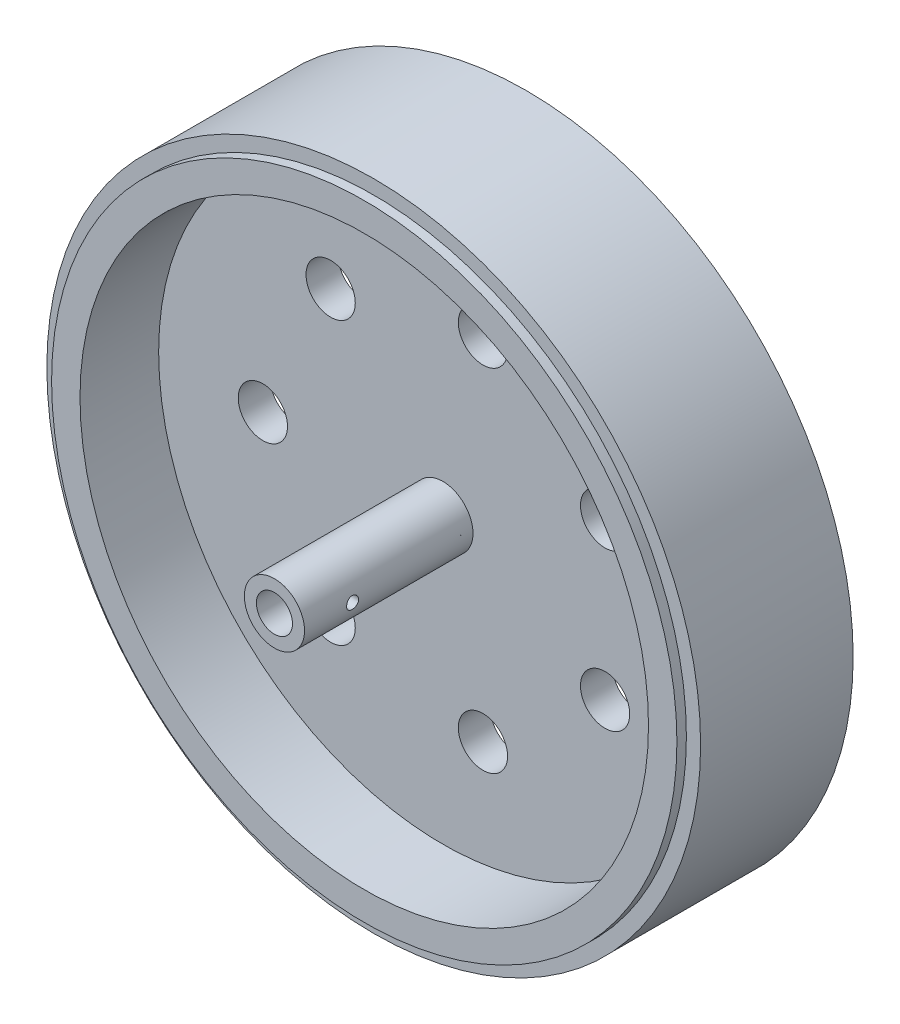
ISO-10303-21;
HEADER;
FILE_DESCRIPTION(('STEP AP214'),'2;1');
FILE_NAME('part.step','',(''),(''),'','','');
FILE_SCHEMA(('AUTOMOTIVE_DESIGN { 1 0 10303 214 1 1 1 1 }'));
ENDSEC;
DATA;
#1=APPLICATION_CONTEXT('core data for automotive mechanical design processes');
#2=APPLICATION_PROTOCOL_DEFINITION('international standard','automotive_design',2000,#1);
#3=PRODUCT_CONTEXT('',#1,'mechanical');
#4=PRODUCT('Part','Part','',(#3));
#5=PRODUCT_RELATED_PRODUCT_CATEGORY('part','',(#4));
#6=PRODUCT_DEFINITION_FORMATION('','',#4);
#7=PRODUCT_DEFINITION_CONTEXT('part definition',#1,'design');
#8=PRODUCT_DEFINITION('design','',#6,#7);
#9=PRODUCT_DEFINITION_SHAPE('','',#8);
#10=(LENGTH_UNIT() NAMED_UNIT(*) SI_UNIT(.MILLI.,.METRE.));
#11=(NAMED_UNIT(*) PLANE_ANGLE_UNIT() SI_UNIT($,.RADIAN.));
#12=(NAMED_UNIT(*) SI_UNIT($,.STERADIAN.) SOLID_ANGLE_UNIT());
#13=UNCERTAINTY_MEASURE_WITH_UNIT(LENGTH_MEASURE(1.E-05),#10,'distance_accuracy_value','');
#14=(GEOMETRIC_REPRESENTATION_CONTEXT(3) GLOBAL_UNCERTAINTY_ASSIGNED_CONTEXT((#13)) GLOBAL_UNIT_ASSIGNED_CONTEXT((#10,
#11,#12)) REPRESENTATION_CONTEXT('',''));
#15=CARTESIAN_POINT('',(0.,0.,0.));
#16=DIRECTION('',(0.,0.,1.));
#17=DIRECTION('',(1.,0.,0.));
#18=AXIS2_PLACEMENT_3D('',#15,#16,#17);
#19=CARTESIAN_POINT('',(0.,0.,21.18));
#20=DIRECTION('',(0.,0.,-1.));
#21=DIRECTION('',(-1.,0.,0.));
#22=AXIS2_PLACEMENT_3D('',#19,#20,#21);
#23=CYLINDRICAL_SURFACE('',#22,3.175);
#24=CARTESIAN_POINT('',(0.,0.,21.18));
#25=DIRECTION('',(0.,0.,1.));
#26=DIRECTION('',(1.,0.,0.));
#27=AXIS2_PLACEMENT_3D('',#24,#25,#26);
#28=CIRCLE('',#27,3.175);
#29=CARTESIAN_POINT('',(3.175,0.,21.18));
#30=VERTEX_POINT('',#29);
#31=EDGE_CURVE('E113',#30,#30,#28,.T.);
#32=ORIENTED_EDGE('',*,*,#31,.F.);
#33=EDGE_LOOP('',(#32));
#34=FACE_BOUND('',#33,.T.);
#35=CARTESIAN_POINT('',(0.,0.,3.4));
#36=DIRECTION('',(0.,0.,1.));
#37=DIRECTION('',(1.,0.,0.));
#38=AXIS2_PLACEMENT_3D('',#35,#36,#37);
#39=CIRCLE('',#38,3.175);
#40=CARTESIAN_POINT('',(3.175,0.,3.4));
#41=VERTEX_POINT('',#40);
#42=EDGE_CURVE('E112',#41,#41,#39,.T.);
#43=ORIENTED_EDGE('',*,*,#42,.T.);
#44=EDGE_LOOP('',(#43));
#45=FACE_BOUND('',#44,.T.);
#46=CARTESIAN_POINT('',(3.17499999999999,0.,16.735));
#47=CARTESIAN_POINT('',(3.17499934963852,0.035291335813322,16.7349987017435));
#48=CARTESIAN_POINT('',(3.17440554588176,0.0705990842279666,16.7320479847155));
#49=CARTESIAN_POINT('',(3.17209402170752,0.140216577382527,16.7203324524268));
#50=CARTESIAN_POINT('',(3.17037540841218,0.174525506638761,16.711563018171));
#51=CARTESIAN_POINT('',(3.16600617291712,0.241128743842204,16.6884917912508));
#52=CARTESIAN_POINT('',(3.16335644363716,0.273424947137541,16.6741952976036));
#53=CARTESIAN_POINT('',(3.15741302752425,0.335158072928783,16.6404915228303));
#54=CARTESIAN_POINT('',(3.15411937904674,0.36459516557314,16.6210845460894));
#55=CARTESIAN_POINT('',(3.14720074984531,0.420175358094938,16.5774320561249));
#56=CARTESIAN_POINT('',(3.14357223395261,0.446274158985663,16.5531306943266));
#57=CARTESIAN_POINT('',(3.13641854587394,0.494053340446097,16.5004993155913));
#58=CARTESIAN_POINT('',(3.13289338177769,0.515733375929218,16.4721689843022));
#59=CARTESIAN_POINT('',(3.12631100551011,0.554248163375738,16.4119652174375));
#60=CARTESIAN_POINT('',(3.12325834176741,0.571037046179825,16.3800618961893));
#61=CARTESIAN_POINT('',(3.11801680217095,0.598999098278496,16.3138160449324));
#62=CARTESIAN_POINT('',(3.11582784098846,0.610172822347646,16.2794737562751));
#63=CARTESIAN_POINT('',(3.1125973133515,0.626443565426864,16.2098014289185));
#64=CARTESIAN_POINT('',(3.11154108518064,0.631618306203822,16.1744902344697));
#65=CARTESIAN_POINT('',(3.11065148163498,0.635985601106084,16.1034862634336));
#66=CARTESIAN_POINT('',(3.11081798122079,0.635178766923071,16.0677935262367));
#67=CARTESIAN_POINT('',(3.11234169979097,0.627668653919654,15.9976082896067));
#68=CARTESIAN_POINT('',(3.11368092565315,0.621054473054879,15.9631058074267));
#69=CARTESIAN_POINT('',(3.11737086811601,0.602258056735636,15.895710291319));
#70=CARTESIAN_POINT('',(3.1197216330219,0.590075555368932,15.8628173343364));
#71=CARTESIAN_POINT('',(3.12518817747759,0.560403237633447,15.7993178088182));
#72=CARTESIAN_POINT('',(3.12830902031702,0.542878106032392,15.7687281964736));
#73=CARTESIAN_POINT('',(3.13496082920894,0.50304291985365,15.7108905102673));
#74=CARTESIAN_POINT('',(3.13849184237362,0.480732315366585,15.6836428209995));
#75=CARTESIAN_POINT('',(3.14564408488328,0.431482458445969,15.6327483294398));
#76=CARTESIAN_POINT('',(3.14926579448925,0.4044671623699,15.6091751194095));
#77=CARTESIAN_POINT('',(3.15613318933649,0.346827490279374,15.5668833075987));
#78=CARTESIAN_POINT('',(3.15937886975498,0.316203067985911,15.5481647680786));
#79=CARTESIAN_POINT('',(3.16513648252163,0.252132710668114,15.5161000316415));
#80=CARTESIAN_POINT('',(3.16764726418653,0.218682455436665,15.5027622475357));
#81=CARTESIAN_POINT('',(3.1716434470729,0.149954600044902,15.4819160989855));
#82=CARTESIAN_POINT('',(3.17312897250337,0.114677221796005,15.4744070283832));
#83=CARTESIAN_POINT('',(3.17488996635461,0.0439289225732406,15.4655356518406));
#84=CARTESIAN_POINT('',(3.17518525904318,0.00847110848674091,15.4640726335919));
#85=CARTESIAN_POINT('',(3.17458757975615,-0.0621823332123733,15.4670636604283));
#86=CARTESIAN_POINT('',(3.17369467457818,-0.0973779754518083,15.4715173728889));
#87=CARTESIAN_POINT('',(3.17083333325091,-0.166183094066053,15.4861317672004));
#88=CARTESIAN_POINT('',(3.16887464016671,-0.199803987195838,15.4962407734962));
#89=CARTESIAN_POINT('',(3.16410055558756,-0.264873503462288,15.5218223289864));
#90=CARTESIAN_POINT('',(3.16128509991034,-0.296321963639837,15.5372952800198));
#91=CARTESIAN_POINT('',(3.15506043823642,-0.356578645290747,15.5733833815636));
#92=CARTESIAN_POINT('',(3.15164438527528,-0.385349830487638,15.5940591659597));
#93=CARTESIAN_POINT('',(3.14461356616975,-0.439050442140694,15.6398848364166));
#94=CARTESIAN_POINT('',(3.14099877874926,-0.463979456171032,15.6650352021639));
#95=CARTESIAN_POINT('',(3.13391107758673,-0.5096767751416,15.7195545784509));
#96=CARTESIAN_POINT('',(3.13044116248148,-0.530375941054894,15.7489819975805));
#97=CARTESIAN_POINT('',(3.12409961790583,-0.566537741732515,15.8109552144615));
#98=CARTESIAN_POINT('',(3.12122796449972,-0.582000586011043,15.8435008873792));
#99=CARTESIAN_POINT('',(3.11643230271083,-0.607156419404544,15.910622836305));
#100=CARTESIAN_POINT('',(3.11450339043839,-0.616879322367316,15.9451875341686));
#101=CARTESIAN_POINT('',(3.11180122362936,-0.630369993783269,16.0155027429667));
#102=CARTESIAN_POINT('',(3.11102781838856,-0.634138538822945,16.0512530986429));
#103=CARTESIAN_POINT('',(3.11073260015926,-0.635584778400841,16.1222306289856));
#104=CARTESIAN_POINT('',(3.11118833685206,-0.633371725425018,16.1574555295687));
#105=CARTESIAN_POINT('',(3.1132498916273,-0.623158713103537,16.2270200976897));
#106=CARTESIAN_POINT('',(3.11485570047152,-0.615158800242103,16.2613597723362));
#107=CARTESIAN_POINT('',(3.11902642779166,-0.593647890996834,16.3281095966377));
#108=CARTESIAN_POINT('',(3.12158901346957,-0.580150291765512,16.360524218919));
#109=CARTESIAN_POINT('',(3.12738589008598,-0.548039699322017,16.4226458626664));
#110=CARTESIAN_POINT('',(3.13062023734298,-0.529426277172049,16.4523526568155));
#111=CARTESIAN_POINT('',(3.13746489932248,-0.487239255889372,16.5087593883154));
#112=CARTESIAN_POINT('',(3.14108066797659,-0.463586758394339,16.5353996659449));
#113=CARTESIAN_POINT('',(3.14824161988691,-0.412155874323345,16.584369240511));
#114=CARTESIAN_POINT('',(3.15178678673122,-0.384376540842368,16.6066975453515));
#115=CARTESIAN_POINT('',(3.15845083566362,-0.325131194471036,16.646629998906));
#116=CARTESIAN_POINT('',(3.16156486824221,-0.293629641612945,16.6641822620828));
#117=CARTESIAN_POINT('',(3.16696804428975,-0.228070639197366,16.6937161878488));
#118=CARTESIAN_POINT('',(3.16925793083021,-0.194015525648086,16.7057028713531));
#119=CARTESIAN_POINT('',(3.1723099659806,-0.133236645466601,16.7214439870084));
#120=CARTESIAN_POINT('',(3.17331282505617,-0.106858856648754,16.7265184280044));
#121=CARTESIAN_POINT('',(3.17465807878832,-0.0536571985083929,16.7332968743476));
#122=CARTESIAN_POINT('',(3.17500049449453,-0.0268333434303733,16.7350009871137));
#123=CARTESIAN_POINT('',(3.17499999999999,0.,16.735));
#124=B_SPLINE_CURVE_WITH_KNOTS('',3,(#46,#47,#48,#49,#50,#51,#52,#53,#54,#55,#56,#57,#58,#59,
#60,#61,#62,#63,#64,#65,#66,#67,#68,#69,#70,#71,#72,#73,#74,#75,#76,#77,#78,#79,#80,#81,#82,#83,
#84,#85,#86,#87,#88,#89,#90,#91,#92,#93,#94,#95,#96,#97,#98,#99,#100,#101,#102,#103,#104,#105,
#106,#107,#108,#109,#110,#111,#112,#113,#114,#115,#116,#117,#118,#119,#120,#121,#122,#123),
.UNSPECIFIED.,.T.,.F.,(4,2,2,2,2,2,2,2,2,2,2,2,2,2,2,2,2,2,2,2,2,2,2,2,2,2,2,2,2,2,2,2,2,2,2,2,
2,2,4),(0.,0.105775842969899,0.211635753188989,0.317394421883967,0.423146792916599,
0.530182245521236,0.637226053934577,0.745243588287612,0.853250448469003,0.959841775407776,
1.06642220218578,1.17139546648987,1.27637374426118,1.38206156279281,1.4877615326604,
1.59536290332008,1.70296565387786,1.81073599532305,1.91849327818252,2.02444817154428,
2.13039710862746,2.23539338258709,2.34039752402174,2.44668716931182,2.55298821599665,
2.66090799147808,2.76882344839401,2.87617141955779,2.98350538889813,3.0888922383049,
3.19427824117806,3.29940895395724,3.40454848414485,3.51147428411855,3.6184246562841,
3.72649430389029,3.83446626753623,3.91489422309082,3.99531961520582),.UNSPECIFIED.);
#125=CARTESIAN_POINT('',(3.17499999999999,0.,16.735));
#126=VERTEX_POINT('',#125);
#127=EDGE_CURVE('E91',#126,#126,#124,.T.);
#128=ORIENTED_EDGE('',*,*,#127,.T.);
#129=EDGE_LOOP('',(#128));
#130=FACE_BOUND('',#129,.T.);
#131=ADVANCED_FACE('F40',(#34,#45,#130),#23,.T.);
#132=CARTESIAN_POINT('',(0.,0.,21.18));
#133=DIRECTION('',(0.,0.,-1.));
#134=DIRECTION('',(-1.,0.,0.));
#135=AXIS2_PLACEMENT_3D('',#132,#133,#134);
#136=CYLINDRICAL_SURFACE('',#135,1.905);
#137=CARTESIAN_POINT('',(0.,0.,21.18));
#138=DIRECTION('',(0.,0.,1.));
#139=DIRECTION('',(1.,0.,0.));
#140=AXIS2_PLACEMENT_3D('',#137,#138,#139);
#141=CIRCLE('',#140,1.905);
#142=CARTESIAN_POINT('',(1.905,0.,21.18));
#143=VERTEX_POINT('',#142);
#144=EDGE_CURVE('E109',#143,#143,#141,.T.);
#145=ORIENTED_EDGE('',*,*,#144,.T.);
#146=EDGE_LOOP('',(#145));
#147=FACE_BOUND('',#146,.T.);
#148=CARTESIAN_POINT('',(1.90499999999999,0.,16.735));
#149=CARTESIAN_POINT('',(1.90500009716099,0.0346477354330693,16.7350001611196));
#150=CARTESIAN_POINT('',(1.90404603637293,0.0692944985319792,16.7321550310092));
#151=CARTESIAN_POINT('',(1.90033408479081,0.137567518154337,16.7208845159011));
#152=CARTESIAN_POINT('',(1.89757600673358,0.171193668355449,16.7124585515924));
#153=CARTESIAN_POINT('',(1.890555705206,0.236431321333628,16.6903472804511));
#154=CARTESIAN_POINT('',(1.88629599709126,0.268046089437633,16.6766707653383));
#155=CARTESIAN_POINT('',(1.87670723030478,0.328533084871378,16.6444863552477));
#156=CARTESIAN_POINT('',(1.87137796073912,0.357404769668769,16.6259775072234));
#157=CARTESIAN_POINT('',(1.86000449971439,0.412585963639148,16.5839806139146));
#158=CARTESIAN_POINT('',(1.85394318354999,0.438787349689459,16.5603551662444));
#159=CARTESIAN_POINT('',(1.84188299886786,0.486938759865793,16.5090878567615));
#160=CARTESIAN_POINT('',(1.83588414437647,0.508887847785692,16.4814451128212));
#161=CARTESIAN_POINT('',(1.82443966124974,0.548528838314809,16.4219544518494));
#162=CARTESIAN_POINT('',(1.81901489947267,0.566080184970808,16.390008475267));
#163=CARTESIAN_POINT('',(1.80959318933609,0.595514984911899,16.3234081800219));
#164=CARTESIAN_POINT('',(1.80559580535171,0.6074001678389,16.2887546916132));
#165=CARTESIAN_POINT('',(1.79966177602124,0.624759648057785,16.2189525043472));
#166=CARTESIAN_POINT('',(1.79766020909309,0.630436539655699,16.1838598725864));
#167=CARTESIAN_POINT('',(1.79575242054755,0.635851613320801,16.1131675160834));
#168=CARTESIAN_POINT('',(1.7958455514437,0.635591630519078,16.0775679514381));
#169=CARTESIAN_POINT('',(1.79805974506426,0.629297638850783,16.0086002396703));
#170=CARTESIAN_POINT('',(1.80008794069511,0.623528034860804,15.975204464147));
#171=CARTESIAN_POINT('',(1.80579177661463,0.606809913409618,15.9098851785491));
#172=CARTESIAN_POINT('',(1.80946761414629,0.595860775885902,15.8779618452486));
#173=CARTESIAN_POINT('',(1.81811873566595,0.568921301868168,15.8158929040096));
#174=CARTESIAN_POINT('',(1.8231139927816,0.552852620929093,15.7857842038269));
#175=CARTESIAN_POINT('',(1.83383274696056,0.51618458250251,15.7286069732423));
#176=CARTESIAN_POINT('',(1.83955645417073,0.495583916351148,15.7015393243973));
#177=CARTESIAN_POINT('',(1.8514525402138,0.449166826253215,15.6497268351679));
#178=CARTESIAN_POINT('',(1.85763274240289,0.423134250298455,15.6251770389867));
#179=CARTESIAN_POINT('',(1.86948405875805,0.367245626930989,15.5807406456687));
#180=CARTESIAN_POINT('',(1.87515512406683,0.337389213244615,15.5608544957655));
#181=CARTESIAN_POINT('',(1.88542363540489,0.274286734284378,15.5261528493507));
#182=CARTESIAN_POINT('',(1.89000987255102,0.241009980524372,15.5113896129986));
#183=CARTESIAN_POINT('',(1.89751060136719,0.172255867936462,15.4877309845381));
#184=CARTESIAN_POINT('',(1.90042567370848,0.136779278228395,15.4788335541061));
#185=CARTESIAN_POINT('',(1.90415943190364,0.0662837317511078,15.4675046520758));
#186=CARTESIAN_POINT('',(1.90506351164419,0.0313115959141768,15.4648096211753));
#187=CARTESIAN_POINT('',(1.90492953211214,-0.0385921694247499,15.465211247735));
#188=CARTESIAN_POINT('',(1.90389180066289,-0.0735238047679755,15.4683069275872));
#189=CARTESIAN_POINT('',(1.90004715695367,-0.141300115103204,15.4799935614123));
#190=CARTESIAN_POINT('',(1.8972923618163,-0.174175932340133,15.4884227408414));
#191=CARTESIAN_POINT('',(1.89034322737072,-0.238033533698021,15.5103348372364));
#192=CARTESIAN_POINT('',(1.88614870449554,-0.269015075702934,15.523818398662));
#193=CARTESIAN_POINT('',(1.87660871367516,-0.329113068209759,15.555849724219));
#194=CARTESIAN_POINT('',(1.87123587370254,-0.358159024103004,15.5745213667351));
#195=CARTESIAN_POINT('',(1.85994836236497,-0.412791167135981,15.6162532852583));
#196=CARTESIAN_POINT('',(1.85403352580849,-0.438376293549757,15.6393149015792));
#197=CARTESIAN_POINT('',(1.8419879846887,-0.486570342457454,15.6904115068902));
#198=CARTESIAN_POINT('',(1.83585968295424,-0.508991215472793,15.7186248591026));
#199=CARTESIAN_POINT('',(1.82435483037233,-0.548803526673743,15.7785449455559));
#200=CARTESIAN_POINT('',(1.81897828579231,-0.566194922929736,15.8102517089175));
#201=CARTESIAN_POINT('',(1.80963818805896,-0.595374050818833,15.8762723647197));
#202=CARTESIAN_POINT('',(1.80567178171901,-0.607173113945581,15.9105808203192));
#203=CARTESIAN_POINT('',(1.7996587857345,-0.624773113413022,15.9808604428288));
#204=CARTESIAN_POINT('',(1.79761133125413,-0.630576751900388,16.01683085305));
#205=CARTESIAN_POINT('',(1.7957664038567,-0.635810439368689,16.0874251559684));
#206=CARTESIAN_POINT('',(1.7958587421863,-0.635552613392437,16.1220232860599));
#207=CARTESIAN_POINT('',(1.79801056401461,-0.629438856343847,16.1906558225613));
#208=CARTESIAN_POINT('',(1.80006993043386,-0.623583258456392,16.2246902624001));
#209=CARTESIAN_POINT('',(1.80584172917129,-0.606661101335631,16.290586146013));
#210=CARTESIAN_POINT('',(1.80952202239851,-0.595695624719446,16.3224765838796));
#211=CARTESIAN_POINT('',(1.8181091325415,-0.56894689725784,16.3839894034041));
#212=CARTESIAN_POINT('',(1.82301622165963,-0.553162577031774,16.4136112798039));
#213=CARTESIAN_POINT('',(1.83377096557278,-0.516420539790361,16.4711471304015));
#214=CARTESIAN_POINT('',(1.83965031892419,-0.495267134155475,16.4989301787056));
#215=CARTESIAN_POINT('',(1.85155431240204,-0.448718230791165,16.5506530314988));
#216=CARTESIAN_POINT('',(1.85757899319449,-0.423321533626697,16.5745917455619));
#217=CARTESIAN_POINT('',(1.86937669383625,-0.367818388644627,16.6188867018037));
#218=CARTESIAN_POINT('',(1.87513075443772,-0.337566961072324,16.6390669608219));
#219=CARTESIAN_POINT('',(1.88548004394634,-0.273911921953207,16.6740339223201));
#220=CARTESIAN_POINT('',(1.89007556901542,-0.24050911901404,16.6888220036605));
#221=CARTESIAN_POINT('',(1.89741502068518,-0.173033465972618,16.7119632366303));
#222=CARTESIAN_POINT('',(1.90023249888301,-0.139057226124518,16.7205743660772));
#223=CARTESIAN_POINT('',(1.90402468485782,-0.0700534641665065,16.73209187823));
#224=CARTESIAN_POINT('',(1.90499990177759,-0.0350262352361537,16.7349998371203));
#225=CARTESIAN_POINT('',(1.90499999999999,0.,16.735));
#226=B_SPLINE_CURVE_WITH_KNOTS('',3,(#148,#149,#150,#151,#152,#153,#154,#155,#156,#157,#158,
#159,#160,#161,#162,#163,#164,#165,#166,#167,#168,#169,#170,#171,#172,#173,#174,#175,#176,#177,
#178,#179,#180,#181,#182,#183,#184,#185,#186,#187,#188,#189,#190,#191,#192,#193,#194,#195,#196,
#197,#198,#199,#200,#201,#202,#203,#204,#205,#206,#207,#208,#209,#210,#211,#212,#213,#214,#215,
#216,#217,#218,#219,#220,#221,#222,#223,#224,#225),.UNSPECIFIED.,.T.,.F.,(4,2,2,2,2,2,2,2,2,2,2,
2,2,2,2,2,2,2,2,2,2,2,2,2,2,2,2,2,2,2,2,2,2,2,2,2,2,2,4),(0.,0.103814312326517,
0.207639402644875,0.311291397272622,0.414963849902427,0.521872745195503,0.628805151375816,
0.738812243629035,0.84878573379949,0.955052228433657,1.0612858757656,1.1626648485457,
1.26405596087738,1.36707988678015,1.47013360118969,1.57856749184725,1.6870117768331,
1.79653187582484,1.90601389731534,2.0107502531074,2.11546892853759,2.21715430310673,
2.31885264749913,2.4232260389528,2.52763134816408,2.63678049523785,2.7459305522373,
2.85485848773011,2.96373730779544,3.06702247940459,3.1703015037616,3.27161897784102,
3.37295895229782,3.47872092337332,3.58451284051636,3.69442784618325,3.80431472519846,
3.90929214555408,4.01424054922255),.UNSPECIFIED.);
#227=CARTESIAN_POINT('',(1.90499999999999,0.,16.735));
#228=VERTEX_POINT('',#227);
#229=EDGE_CURVE('E89',#228,#228,#226,.T.);
#230=ORIENTED_EDGE('',*,*,#229,.F.);
#231=EDGE_LOOP('',(#230));
#232=FACE_BOUND('',#231,.T.);
#233=CARTESIAN_POINT('',(0.,0.,-5.08));
#234=DIRECTION('',(0.,0.,-1.));
#235=DIRECTION('',(-1.,0.,0.));
#236=AXIS2_PLACEMENT_3D('',#233,#234,#235);
#237=CIRCLE('',#236,1.905);
#238=CARTESIAN_POINT('',(-1.905,0.,-5.08));
#239=VERTEX_POINT('',#238);
#240=EDGE_CURVE('E292',#239,#239,#237,.T.);
#241=ORIENTED_EDGE('',*,*,#240,.T.);
#242=EDGE_LOOP('',(#241));
#243=FACE_BOUND('',#242,.T.);
#244=ADVANCED_FACE('F182',(#147,#232,#243),#136,.F.);
#245=CARTESIAN_POINT('',(0.,0.,3.4));
#246=DIRECTION('',(0.,0.,1.));
#247=DIRECTION('',(1.,0.,0.));
#248=AXIS2_PLACEMENT_3D('',#245,#246,#247);
#249=PLANE('',#248);
#250=CARTESIAN_POINT('',(4.22789774516979,18.5236303314547,3.4));
#251=DIRECTION('',(0.,0.,1.));
#252=DIRECTION('',(1.,0.,0.));
#253=AXIS2_PLACEMENT_3D('',#250,#251,#252);
#254=CIRCLE('',#253,2.6);
#255=CARTESIAN_POINT('',(6.8278977451698,18.5236303314547,3.4));
#256=VERTEX_POINT('',#255);
#257=EDGE_CURVE('E76',#256,#256,#254,.F.);
#258=ORIENTED_EDGE('',*,*,#257,.T.);
#259=EDGE_LOOP('',(#258));
#260=FACE_BOUND('',#259,.T.);
#261=CARTESIAN_POINT('',(17.118408490146,-8.2437910432335,3.4));
#262=DIRECTION('',(0.,0.,1.));
#263=DIRECTION('',(1.,0.,0.));
#264=AXIS2_PLACEMENT_3D('',#261,#262,#263);
#265=CIRCLE('',#264,2.6);
#266=CARTESIAN_POINT('',(19.718408490146,-8.2437910432335,3.4));
#267=VERTEX_POINT('',#266);
#268=EDGE_CURVE('E69',#267,#267,#265,.F.);
#269=ORIENTED_EDGE('',*,*,#268,.T.);
#270=EDGE_LOOP('',(#269));
#271=FACE_BOUND('',#270,.T.);
#272=CARTESIAN_POINT('',(-11.8463062353159,-14.8547981668926,3.4));
#273=DIRECTION('',(0.,0.,1.));
#274=DIRECTION('',(1.,0.,0.));
#275=AXIS2_PLACEMENT_3D('',#272,#273,#274);
#276=CIRCLE('',#275,2.6);
#277=CARTESIAN_POINT('',(-9.24630623531591,-14.8547981668926,3.4));
#278=VERTEX_POINT('',#277);
#279=EDGE_CURVE('E61',#278,#278,#276,.F.);
#280=ORIENTED_EDGE('',*,*,#279,.T.);
#281=EDGE_LOOP('',(#280));
#282=FACE_BOUND('',#281,.T.);
#283=ORIENTED_EDGE('',*,*,#42,.F.);
#284=EDGE_LOOP('',(#283));
#285=FACE_BOUND('',#284,.T.);
#286=CARTESIAN_POINT('',(0.,0.,3.4));
#287=DIRECTION('',(0.,0.,1.));
#288=DIRECTION('',(1.,0.,0.));
#289=AXIS2_PLACEMENT_3D('',#286,#287,#288);
#290=CIRCLE('',#289,30.);
#291=CARTESIAN_POINT('',(-30.,0.,3.4));
#292=VERTEX_POINT('',#291);
#293=EDGE_CURVE('E48',#292,#292,#290,.F.);
#294=ORIENTED_EDGE('',*,*,#293,.F.);
#295=EDGE_LOOP('',(#294));
#296=FACE_BOUND('',#295,.T.);
#297=CARTESIAN_POINT('',(-19.,0.,3.4));
#298=DIRECTION('',(0.,0.,1.));
#299=DIRECTION('',(1.,0.,0.));
#300=AXIS2_PLACEMENT_3D('',#297,#298,#299);
#301=CIRCLE('',#300,2.6);
#302=CARTESIAN_POINT('',(-16.4,0.,3.4));
#303=VERTEX_POINT('',#302);
#304=EDGE_CURVE('E60',#303,#303,#301,.F.);
#305=ORIENTED_EDGE('',*,*,#304,.T.);
#306=EDGE_LOOP('',(#305));
#307=FACE_BOUND('',#306,.T.);
#308=CARTESIAN_POINT('',(4.22789774517005,-18.5236303314546,3.4));
#309=DIRECTION('',(0.,0.,1.));
#310=DIRECTION('',(1.,0.,0.));
#311=AXIS2_PLACEMENT_3D('',#308,#309,#310);
#312=CIRCLE('',#311,2.6);
#313=CARTESIAN_POINT('',(6.82789774517004,-18.5236303314546,3.4));
#314=VERTEX_POINT('',#313);
#315=EDGE_CURVE('E65',#314,#314,#312,.F.);
#316=ORIENTED_EDGE('',*,*,#315,.T.);
#317=EDGE_LOOP('',(#316));
#318=FACE_BOUND('',#317,.T.);
#319=CARTESIAN_POINT('',(17.1184084901459,8.24379104323374,3.4));
#320=DIRECTION('',(0.,0.,1.));
#321=DIRECTION('',(1.,0.,0.));
#322=AXIS2_PLACEMENT_3D('',#319,#320,#321);
#323=CIRCLE('',#322,2.6);
#324=CARTESIAN_POINT('',(19.7184084901459,8.24379104323374,3.4));
#325=VERTEX_POINT('',#324);
#326=EDGE_CURVE('E73',#325,#325,#323,.F.);
#327=ORIENTED_EDGE('',*,*,#326,.T.);
#328=EDGE_LOOP('',(#327));
#329=FACE_BOUND('',#328,.T.);
#330=CARTESIAN_POINT('',(-11.8463062353161,14.8547981668924,3.4));
#331=DIRECTION('',(0.,0.,1.));
#332=DIRECTION('',(1.,0.,0.));
#333=AXIS2_PLACEMENT_3D('',#330,#331,#332);
#334=CIRCLE('',#333,2.6);
#335=CARTESIAN_POINT('',(-9.24630623531612,14.8547981668924,3.4));
#336=VERTEX_POINT('',#335);
#337=EDGE_CURVE('E79',#336,#336,#334,.F.);
#338=ORIENTED_EDGE('',*,*,#337,.T.);
#339=EDGE_LOOP('',(#338));
#340=FACE_BOUND('',#339,.T.);
#341=ADVANCED_FACE('F152',(#260,#271,#282,#285,#296,#307,#318,#329,#340),#249,.T.);
#342=CARTESIAN_POINT('',(0.,0.,0.));
#343=DIRECTION('',(0.,0.,1.));
#344=DIRECTION('',(1.,0.,0.));
#345=AXIS2_PLACEMENT_3D('',#342,#343,#344);
#346=PLANE('',#345);
#347=CARTESIAN_POINT('',(0.,0.,0.));
#348=DIRECTION('',(0.,0.,1.));
#349=DIRECTION('',(1.,0.,0.));
#350=AXIS2_PLACEMENT_3D('',#347,#348,#349);
#351=CIRCLE('',#350,30.);
#352=CARTESIAN_POINT('',(30.,0.,0.));
#353=VERTEX_POINT('',#352);
#354=EDGE_CURVE('E53',#353,#353,#351,.T.);
#355=ORIENTED_EDGE('',*,*,#354,.F.);
#356=EDGE_LOOP('',(#355));
#357=FACE_BOUND('',#356,.T.);
#358=CARTESIAN_POINT('',(0.,0.,0.));
#359=DIRECTION('',(0.,0.,1.));
#360=DIRECTION('',(1.,0.,0.));
#361=AXIS2_PLACEMENT_3D('',#358,#359,#360);
#362=CIRCLE('',#361,3.175);
#363=CARTESIAN_POINT('',(3.175,0.,0.));
#364=VERTEX_POINT('',#363);
#365=EDGE_CURVE('E11',#364,#364,#362,.F.);
#366=ORIENTED_EDGE('',*,*,#365,.F.);
#367=EDGE_LOOP('',(#366));
#368=FACE_BOUND('',#367,.T.);
#369=CARTESIAN_POINT('',(-19.,0.,0.));
#370=DIRECTION('',(0.,0.,1.));
#371=DIRECTION('',(1.,0.,0.));
#372=AXIS2_PLACEMENT_3D('',#369,#370,#371);
#373=CIRCLE('',#372,2.6);
#374=CARTESIAN_POINT('',(-16.4,0.,0.));
#375=VERTEX_POINT('',#374);
#376=EDGE_CURVE('E57',#375,#375,#373,.F.);
#377=ORIENTED_EDGE('',*,*,#376,.F.);
#378=EDGE_LOOP('',(#377));
#379=FACE_BOUND('',#378,.T.);
#380=CARTESIAN_POINT('',(-11.8463062353159,-14.8547981668926,0.));
#381=DIRECTION('',(0.,0.,1.));
#382=DIRECTION('',(1.,0.,0.));
#383=AXIS2_PLACEMENT_3D('',#380,#381,#382);
#384=CIRCLE('',#383,2.6);
#385=CARTESIAN_POINT('',(-9.24630623531591,-14.8547981668926,0.));
#386=VERTEX_POINT('',#385);
#387=EDGE_CURVE('E62',#386,#386,#384,.F.);
#388=ORIENTED_EDGE('',*,*,#387,.F.);
#389=EDGE_LOOP('',(#388));
#390=FACE_BOUND('',#389,.T.);
#391=CARTESIAN_POINT('',(4.22789774517005,-18.5236303314546,0.));
#392=DIRECTION('',(0.,0.,1.));
#393=DIRECTION('',(1.,0.,0.));
#394=AXIS2_PLACEMENT_3D('',#391,#392,#393);
#395=CIRCLE('',#394,2.6);
#396=CARTESIAN_POINT('',(6.82789774517004,-18.5236303314546,0.));
#397=VERTEX_POINT('',#396);
#398=EDGE_CURVE('E66',#397,#397,#395,.F.);
#399=ORIENTED_EDGE('',*,*,#398,.F.);
#400=EDGE_LOOP('',(#399));
#401=FACE_BOUND('',#400,.T.);
#402=CARTESIAN_POINT('',(17.118408490146,-8.2437910432335,0.));
#403=DIRECTION('',(0.,0.,1.));
#404=DIRECTION('',(1.,0.,0.));
#405=AXIS2_PLACEMENT_3D('',#402,#403,#404);
#406=CIRCLE('',#405,2.6);
#407=CARTESIAN_POINT('',(19.718408490146,-8.2437910432335,0.));
#408=VERTEX_POINT('',#407);
#409=EDGE_CURVE('E70',#408,#408,#406,.F.);
#410=ORIENTED_EDGE('',*,*,#409,.F.);
#411=EDGE_LOOP('',(#410));
#412=FACE_BOUND('',#411,.T.);
#413=CARTESIAN_POINT('',(17.1184084901459,8.24379104323374,0.));
#414=DIRECTION('',(0.,0.,1.));
#415=DIRECTION('',(1.,0.,0.));
#416=AXIS2_PLACEMENT_3D('',#413,#414,#415);
#417=CIRCLE('',#416,2.6);
#418=CARTESIAN_POINT('',(19.7184084901459,8.24379104323374,0.));
#419=VERTEX_POINT('',#418);
#420=EDGE_CURVE('E74',#419,#419,#417,.F.);
#421=ORIENTED_EDGE('',*,*,#420,.F.);
#422=EDGE_LOOP('',(#421));
#423=FACE_BOUND('',#422,.T.);
#424=CARTESIAN_POINT('',(4.22789774516979,18.5236303314547,0.));
#425=DIRECTION('',(0.,0.,1.));
#426=DIRECTION('',(1.,0.,0.));
#427=AXIS2_PLACEMENT_3D('',#424,#425,#426);
#428=CIRCLE('',#427,2.6);
#429=CARTESIAN_POINT('',(6.8278977451698,18.5236303314547,0.));
#430=VERTEX_POINT('',#429);
#431=EDGE_CURVE('E77',#430,#430,#428,.F.);
#432=ORIENTED_EDGE('',*,*,#431,.F.);
#433=EDGE_LOOP('',(#432));
#434=FACE_BOUND('',#433,.T.);
#435=CARTESIAN_POINT('',(-11.8463062353161,14.8547981668924,0.));
#436=DIRECTION('',(0.,0.,1.));
#437=DIRECTION('',(1.,0.,0.));
#438=AXIS2_PLACEMENT_3D('',#435,#436,#437);
#439=CIRCLE('',#438,2.6);
#440=CARTESIAN_POINT('',(-9.24630623531612,14.8547981668924,0.));
#441=VERTEX_POINT('',#440);
#442=EDGE_CURVE('E44',#441,#441,#439,.F.);
#443=ORIENTED_EDGE('',*,*,#442,.F.);
#444=EDGE_LOOP('',(#443));
#445=FACE_BOUND('',#444,.T.);
#446=ADVANCED_FACE('F42',(#357,#368,#379,#390,#401,#412,#423,#434,#445),#346,.F.);
#447=CARTESIAN_POINT('',(0.,0.,-6.4));
#448=DIRECTION('',(0.,0.,1.));
#449=DIRECTION('',(1.,0.,0.));
#450=AXIS2_PLACEMENT_3D('',#447,#448,#449);
#451=CYLINDRICAL_SURFACE('',#450,34.5);
#452=CARTESIAN_POINT('',(0.,0.,-5.4));
#453=DIRECTION('',(0.,0.,-1.));
#454=DIRECTION('',(-1.,0.,0.));
#455=AXIS2_PLACEMENT_3D('',#452,#453,#454);
#456=CIRCLE('',#455,34.5);
#457=CARTESIAN_POINT('',(34.5,0.,-5.4));
#458=VERTEX_POINT('',#457);
#459=EDGE_CURVE('E134',#458,#458,#456,.T.);
#460=CARTESIAN_POINT('',(0.,0.,10.7));
#461=DIRECTION('',(0.,0.,1.));
#462=DIRECTION('',(1.,0.,0.));
#463=AXIS2_PLACEMENT_3D('',#460,#461,#462);
#464=CIRCLE('',#463,34.5);
#465=CARTESIAN_POINT('',(34.5,0.,10.7));
#466=VERTEX_POINT('',#465);
#467=EDGE_CURVE('E125',#466,#466,#464,.T.);
#468=CARTESIAN_POINT('',(34.5,0.,-5.4));
#469=CARTESIAN_POINT('',(34.5,0.,-5.23229166666667));
#470=CARTESIAN_POINT('',(34.5,0.,-5.06458333333333));
#471=CARTESIAN_POINT('',(34.5,0.,-4.72916666666667));
#472=CARTESIAN_POINT('',(34.5,0.,-4.56145833333333));
#473=CARTESIAN_POINT('',(34.5,0.,-4.22604166666667));
#474=CARTESIAN_POINT('',(34.5,0.,-4.05833333333333));
#475=CARTESIAN_POINT('',(34.5,0.,-3.72291666666667));
#476=CARTESIAN_POINT('',(34.5,0.,-3.55520833333333));
#477=CARTESIAN_POINT('',(34.5,0.,-3.21979166666667));
#478=CARTESIAN_POINT('',(34.5,0.,-3.05208333333333));
#479=CARTESIAN_POINT('',(34.5,0.,-2.71666666666667));
#480=CARTESIAN_POINT('',(34.5,0.,-2.54895833333333));
#481=CARTESIAN_POINT('',(34.5,0.,-2.21354166666667));
#482=CARTESIAN_POINT('',(34.5,0.,-2.04583333333333));
#483=CARTESIAN_POINT('',(34.5,0.,-1.71041666666667));
#484=CARTESIAN_POINT('',(34.5,0.,-1.54270833333333));
#485=CARTESIAN_POINT('',(34.5,0.,-1.20729166666667));
#486=CARTESIAN_POINT('',(34.5,0.,-1.03958333333333));
#487=CARTESIAN_POINT('',(34.5,0.,-0.704166666666667));
#488=CARTESIAN_POINT('',(34.5,0.,-0.536458333333334));
#489=CARTESIAN_POINT('',(34.5,0.,-0.201041666666667));
#490=CARTESIAN_POINT('',(34.5,0.,-0.0333333333333334));
#491=CARTESIAN_POINT('',(34.5,0.,0.302083333333333));
#492=CARTESIAN_POINT('',(34.5,0.,0.469791666666667));
#493=CARTESIAN_POINT('',(34.5,0.,0.805208333333333));
#494=CARTESIAN_POINT('',(34.5,0.,0.972916666666667));
#495=CARTESIAN_POINT('',(34.5,0.,1.30833333333333));
#496=CARTESIAN_POINT('',(34.5,0.,1.47604166666667));
#497=CARTESIAN_POINT('',(34.5,0.,1.81145833333333));
#498=CARTESIAN_POINT('',(34.5,0.,1.97916666666667));
#499=CARTESIAN_POINT('',(34.5,0.,2.31458333333333));
#500=CARTESIAN_POINT('',(34.5,0.,2.48229166666667));
#501=CARTESIAN_POINT('',(34.5,0.,2.81770833333333));
#502=CARTESIAN_POINT('',(34.5,0.,2.98541666666667));
#503=CARTESIAN_POINT('',(34.5,0.,3.32083333333333));
#504=CARTESIAN_POINT('',(34.5,0.,3.48854166666667));
#505=CARTESIAN_POINT('',(34.5,0.,3.82395833333333));
#506=CARTESIAN_POINT('',(34.5,0.,3.99166666666667));
#507=CARTESIAN_POINT('',(34.5,0.,4.32708333333333));
#508=CARTESIAN_POINT('',(34.5,0.,4.49479166666667));
#509=CARTESIAN_POINT('',(34.5,0.,4.83020833333333));
#510=CARTESIAN_POINT('',(34.5,0.,4.99791666666667));
#511=CARTESIAN_POINT('',(34.5,0.,5.33333333333333));
#512=CARTESIAN_POINT('',(34.5,0.,5.50104166666667));
#513=CARTESIAN_POINT('',(34.5,0.,5.83645833333333));
#514=CARTESIAN_POINT('',(34.5,0.,6.00416666666667));
#515=CARTESIAN_POINT('',(34.5,0.,6.33958333333333));
#516=CARTESIAN_POINT('',(34.5,0.,6.50729166666667));
#517=CARTESIAN_POINT('',(34.5,0.,6.84270833333333));
#518=CARTESIAN_POINT('',(34.5,0.,7.01041666666667));
#519=CARTESIAN_POINT('',(34.5,0.,7.34583333333333));
#520=CARTESIAN_POINT('',(34.5,0.,7.51354166666667));
#521=CARTESIAN_POINT('',(34.5,0.,7.84895833333333));
#522=CARTESIAN_POINT('',(34.5,0.,8.01666666666667));
#523=CARTESIAN_POINT('',(34.5,0.,8.35208333333333));
#524=CARTESIAN_POINT('',(34.5,0.,8.51979166666667));
#525=CARTESIAN_POINT('',(34.5,0.,8.85520833333334));
#526=CARTESIAN_POINT('',(34.5,0.,9.02291666666667));
#527=CARTESIAN_POINT('',(34.5,0.,9.35833333333333));
#528=CARTESIAN_POINT('',(34.5,0.,9.52604166666667));
#529=CARTESIAN_POINT('',(34.5,0.,9.86145833333333));
#530=CARTESIAN_POINT('',(34.5,0.,10.0291666666667));
#531=CARTESIAN_POINT('',(34.5,0.,10.3645833333333));
#532=CARTESIAN_POINT('',(34.5,0.,10.5322916666667));
#533=CARTESIAN_POINT('',(34.5,0.,10.7));
#534=B_SPLINE_CURVE_WITH_KNOTS('',3,(#468,#469,#470,#471,#472,#473,#474,#475,#476,#477,#478,
#479,#480,#481,#482,#483,#484,#485,#486,#487,#488,#489,#490,#491,#492,#493,#494,#495,#496,#497,
#498,#499,#500,#501,#502,#503,#504,#505,#506,#507,#508,#509,#510,#511,#512,#513,#514,#515,#516,
#517,#518,#519,#520,#521,#522,#523,#524,#525,#526,#527,#528,#529,#530,#531,#532,#533),
.UNSPECIFIED.,.F.,.F.,(4,2,2,2,2,2,2,2,2,2,2,2,2,2,2,2,2,2,2,2,2,2,2,2,2,2,2,2,2,2,2,2,4),(0.,
0.503125,1.00625,1.509375,2.0125,2.515625,3.01875,3.521875,4.025,4.528125,5.03125,5.534375,
6.0375,6.540625,7.04375,7.546875,8.05,8.553125,9.05625,9.559375,10.0625,10.565625,11.06875,
11.571875,12.075,12.578125,13.08125,13.584375,14.0875,14.590625,15.09375,15.596875,16.1),.UNSPECIFIED.);
#535=EDGE_CURVE('BSEAM151',#458,#466,#534,.T.);
#536=ORIENTED_EDGE('',*,*,#459,.F.);
#537=ORIENTED_EDGE('',*,*,#467,.F.);
#538=ORIENTED_EDGE('',*,*,#535,.T.);
#539=ORIENTED_EDGE('',*,*,#535,.F.);
#540=EDGE_LOOP('',(#536,#538,#537,#539));
#541=FACE_BOUND('',#540,.T.);
#542=ADVANCED_FACE('F151',(#541),#451,.T.);
#543=CARTESIAN_POINT('',(0.,0.,-5.4));
#544=DIRECTION('',(0.,0.,-1.));
#545=DIRECTION('',(-1.,0.,0.));
#546=AXIS2_PLACEMENT_3D('',#543,#544,#545);
#547=PLANE('',#546);
#548=CARTESIAN_POINT('',(0.,0.,-5.4));
#549=DIRECTION('',(0.,0.,-1.));
#550=DIRECTION('',(-1.,0.,0.));
#551=AXIS2_PLACEMENT_3D('',#548,#549,#550);
#552=CIRCLE('',#551,33.);
#553=CARTESIAN_POINT('',(-33.,0.,-5.4));
#554=VERTEX_POINT('',#553);
#555=EDGE_CURVE('E131',#554,#554,#552,.T.);
#556=ORIENTED_EDGE('',*,*,#555,.F.);
#557=EDGE_LOOP('',(#556));
#558=FACE_BOUND('',#557,.T.);
#559=ORIENTED_EDGE('',*,*,#459,.T.);
#560=EDGE_LOOP('',(#559));
#561=FACE_BOUND('',#560,.T.);
#562=ADVANCED_FACE('F217',(#558,#561),#547,.T.);
#563=CARTESIAN_POINT('',(0.,0.,-5.4));
#564=DIRECTION('',(0.,0.,-1.));
#565=DIRECTION('',(-1.,0.,0.));
#566=AXIS2_PLACEMENT_3D('',#563,#564,#565);
#567=CYLINDRICAL_SURFACE('',#566,33.);
#568=ORIENTED_EDGE('',*,*,#555,.T.);
#569=EDGE_LOOP('',(#568));
#570=FACE_BOUND('',#569,.T.);
#571=CARTESIAN_POINT('',(0.,0.,-6.4));
#572=DIRECTION('',(0.,0.,-1.));
#573=DIRECTION('',(-1.,0.,0.));
#574=AXIS2_PLACEMENT_3D('',#571,#572,#573);
#575=CIRCLE('',#574,33.);
#576=CARTESIAN_POINT('',(-33.,0.,-6.4));
#577=VERTEX_POINT('',#576);
#578=EDGE_CURVE('E130',#577,#577,#575,.T.);
#579=ORIENTED_EDGE('',*,*,#578,.F.);
#580=EDGE_LOOP('',(#579));
#581=FACE_BOUND('',#580,.T.);
#582=ADVANCED_FACE('F214',(#570,#581),#567,.T.);
#583=CARTESIAN_POINT('',(0.,0.,-6.4));
#584=DIRECTION('',(0.,0.,1.));
#585=DIRECTION('',(1.,0.,0.));
#586=AXIS2_PLACEMENT_3D('',#583,#584,#585);
#587=CYLINDRICAL_SURFACE('',#586,30.);
#588=CARTESIAN_POINT('',(0.,0.,-6.4));
#589=DIRECTION('',(0.,0.,-1.));
#590=DIRECTION('',(-1.,0.,0.));
#591=AXIS2_PLACEMENT_3D('',#588,#589,#590);
#592=CIRCLE('',#591,30.);
#593=CARTESIAN_POINT('',(-30.,0.,-6.4));
#594=VERTEX_POINT('',#593);
#595=EDGE_CURVE('E142',#594,#594,#592,.T.);
#596=ORIENTED_EDGE('',*,*,#595,.T.);
#597=EDGE_LOOP('',(#596));
#598=FACE_BOUND('',#597,.T.);
#599=ORIENTED_EDGE('',*,*,#354,.T.);
#600=EDGE_LOOP('',(#599));
#601=FACE_BOUND('',#600,.T.);
#602=ADVANCED_FACE('F147',(#598,#601),#587,.F.);
#603=CARTESIAN_POINT('',(0.,0.,-6.4));
#604=DIRECTION('',(0.,0.,-1.));
#605=DIRECTION('',(-1.,0.,0.));
#606=AXIS2_PLACEMENT_3D('',#603,#604,#605);
#607=PLANE('',#606);
#608=ORIENTED_EDGE('',*,*,#595,.F.);
#609=EDGE_LOOP('',(#608));
#610=FACE_BOUND('',#609,.T.);
#611=ORIENTED_EDGE('',*,*,#578,.T.);
#612=EDGE_LOOP('',(#611));
#613=FACE_BOUND('',#612,.T.);
#614=ADVANCED_FACE('F212',(#610,#613),#607,.T.);
#615=CARTESIAN_POINT('',(0.,0.,10.7));
#616=DIRECTION('',(0.,0.,1.));
#617=DIRECTION('',(1.,0.,0.));
#618=AXIS2_PLACEMENT_3D('',#615,#616,#617);
#619=PLANE('',#618);
#620=CARTESIAN_POINT('',(0.,0.,10.7));
#621=DIRECTION('',(0.,0.,1.));
#622=DIRECTION('',(1.,0.,0.));
#623=AXIS2_PLACEMENT_3D('',#620,#621,#622);
#624=CIRCLE('',#623,33.);
#625=CARTESIAN_POINT('',(33.,0.,10.7));
#626=VERTEX_POINT('',#625);
#627=EDGE_CURVE('E122',#626,#626,#624,.T.);
#628=ORIENTED_EDGE('',*,*,#627,.F.);
#629=EDGE_LOOP('',(#628));
#630=FACE_BOUND('',#629,.T.);
#631=ORIENTED_EDGE('',*,*,#467,.T.);
#632=EDGE_LOOP('',(#631));
#633=FACE_BOUND('',#632,.T.);
#634=ADVANCED_FACE('F208',(#630,#633),#619,.T.);
#635=CARTESIAN_POINT('',(0.,0.,10.7));
#636=DIRECTION('',(0.,0.,1.));
#637=DIRECTION('',(1.,0.,0.));
#638=AXIS2_PLACEMENT_3D('',#635,#636,#637);
#639=CYLINDRICAL_SURFACE('',#638,33.);
#640=ORIENTED_EDGE('',*,*,#627,.T.);
#641=EDGE_LOOP('',(#640));
#642=FACE_BOUND('',#641,.T.);
#643=CARTESIAN_POINT('',(0.,0.,11.7));
#644=DIRECTION('',(0.,0.,1.));
#645=DIRECTION('',(1.,0.,0.));
#646=AXIS2_PLACEMENT_3D('',#643,#644,#645);
#647=CIRCLE('',#646,33.);
#648=CARTESIAN_POINT('',(33.,0.,11.7));
#649=VERTEX_POINT('',#648);
#650=EDGE_CURVE('E121',#649,#649,#647,.T.);
#651=ORIENTED_EDGE('',*,*,#650,.F.);
#652=EDGE_LOOP('',(#651));
#653=FACE_BOUND('',#652,.T.);
#654=ADVANCED_FACE('F204',(#642,#653),#639,.T.);
#655=CARTESIAN_POINT('',(0.,0.,11.7));
#656=DIRECTION('',(0.,0.,-1.));
#657=DIRECTION('',(-1.,0.,0.));
#658=AXIS2_PLACEMENT_3D('',#655,#656,#657);
#659=CYLINDRICAL_SURFACE('',#658,30.);
#660=CARTESIAN_POINT('',(0.,0.,11.7));
#661=DIRECTION('',(0.,0.,1.));
#662=DIRECTION('',(1.,0.,0.));
#663=AXIS2_PLACEMENT_3D('',#660,#661,#662);
#664=CIRCLE('',#663,30.);
#665=CARTESIAN_POINT('',(-30.,0.,11.7));
#666=VERTEX_POINT('',#665);
#667=EDGE_CURVE('E139',#666,#666,#664,.T.);
#668=CARTESIAN_POINT('',(-30.,0.,11.7));
#669=CARTESIAN_POINT('',(-30.,0.,11.6135416666667));
#670=CARTESIAN_POINT('',(-30.,0.,11.5270833333333));
#671=CARTESIAN_POINT('',(-30.,0.,11.3541666666667));
#672=CARTESIAN_POINT('',(-30.,0.,11.2677083333333));
#673=CARTESIAN_POINT('',(-30.,0.,11.0947916666667));
#674=CARTESIAN_POINT('',(-30.,0.,11.0083333333333));
#675=CARTESIAN_POINT('',(-30.,0.,10.8354166666667));
#676=CARTESIAN_POINT('',(-30.,0.,10.7489583333333));
#677=CARTESIAN_POINT('',(-30.,0.,10.5760416666667));
#678=CARTESIAN_POINT('',(-30.,0.,10.4895833333333));
#679=CARTESIAN_POINT('',(-30.,0.,10.3166666666667));
#680=CARTESIAN_POINT('',(-30.,0.,10.2302083333333));
#681=CARTESIAN_POINT('',(-30.,0.,10.0572916666667));
#682=CARTESIAN_POINT('',(-30.,0.,9.97083333333333));
#683=CARTESIAN_POINT('',(-30.,0.,9.79791666666667));
#684=CARTESIAN_POINT('',(-30.,0.,9.71145833333333));
#685=CARTESIAN_POINT('',(-30.,0.,9.53854166666667));
#686=CARTESIAN_POINT('',(-30.,0.,9.45208333333333));
#687=CARTESIAN_POINT('',(-30.,0.,9.27916666666667));
#688=CARTESIAN_POINT('',(-30.,0.,9.19270833333333));
#689=CARTESIAN_POINT('',(-30.,0.,9.01979166666667));
#690=CARTESIAN_POINT('',(-30.,0.,8.93333333333333));
#691=CARTESIAN_POINT('',(-30.,0.,8.76041666666667));
#692=CARTESIAN_POINT('',(-30.,0.,8.67395833333333));
#693=CARTESIAN_POINT('',(-30.,0.,8.50104166666667));
#694=CARTESIAN_POINT('',(-30.,0.,8.41458333333333));
#695=CARTESIAN_POINT('',(-30.,0.,8.24166666666667));
#696=CARTESIAN_POINT('',(-30.,0.,8.15520833333333));
#697=CARTESIAN_POINT('',(-30.,0.,7.98229166666667));
#698=CARTESIAN_POINT('',(-30.,0.,7.89583333333333));
#699=CARTESIAN_POINT('',(-30.,0.,7.72291666666667));
#700=CARTESIAN_POINT('',(-30.,0.,7.63645833333333));
#701=CARTESIAN_POINT('',(-30.,0.,7.46354166666667));
#702=CARTESIAN_POINT('',(-30.,0.,7.37708333333333));
#703=CARTESIAN_POINT('',(-30.,0.,7.20416666666667));
#704=CARTESIAN_POINT('',(-30.,0.,7.11770833333333));
#705=CARTESIAN_POINT('',(-30.,0.,6.94479166666667));
#706=CARTESIAN_POINT('',(-30.,0.,6.85833333333333));
#707=CARTESIAN_POINT('',(-30.,0.,6.68541666666667));
#708=CARTESIAN_POINT('',(-30.,0.,6.59895833333333));
#709=CARTESIAN_POINT('',(-30.,0.,6.42604166666667));
#710=CARTESIAN_POINT('',(-30.,0.,6.33958333333333));
#711=CARTESIAN_POINT('',(-30.,0.,6.16666666666667));
#712=CARTESIAN_POINT('',(-30.,0.,6.08020833333333));
#713=CARTESIAN_POINT('',(-30.,0.,5.90729166666667));
#714=CARTESIAN_POINT('',(-30.,0.,5.82083333333333));
#715=CARTESIAN_POINT('',(-30.,0.,5.64791666666667));
#716=CARTESIAN_POINT('',(-30.,0.,5.56145833333333));
#717=CARTESIAN_POINT('',(-30.,0.,5.38854166666667));
#718=CARTESIAN_POINT('',(-30.,0.,5.30208333333333));
#719=CARTESIAN_POINT('',(-30.,0.,5.12916666666667));
#720=CARTESIAN_POINT('',(-30.,0.,5.04270833333333));
#721=CARTESIAN_POINT('',(-30.,0.,4.86979166666667));
#722=CARTESIAN_POINT('',(-30.,0.,4.78333333333333));
#723=CARTESIAN_POINT('',(-30.,0.,4.61041666666667));
#724=CARTESIAN_POINT('',(-30.,0.,4.52395833333333));
#725=CARTESIAN_POINT('',(-30.,0.,4.35104166666667));
#726=CARTESIAN_POINT('',(-30.,0.,4.26458333333333));
#727=CARTESIAN_POINT('',(-30.,0.,4.09166666666667));
#728=CARTESIAN_POINT('',(-30.,0.,4.00520833333333));
#729=CARTESIAN_POINT('',(-30.,0.,3.83229166666667));
#730=CARTESIAN_POINT('',(-30.,0.,3.74583333333333));
#731=CARTESIAN_POINT('',(-30.,0.,3.57291666666667));
#732=CARTESIAN_POINT('',(-30.,0.,3.48645833333333));
#733=CARTESIAN_POINT('',(-30.,0.,3.4));
#734=B_SPLINE_CURVE_WITH_KNOTS('',3,(#668,#669,#670,#671,#672,#673,#674,#675,#676,#677,#678,
#679,#680,#681,#682,#683,#684,#685,#686,#687,#688,#689,#690,#691,#692,#693,#694,#695,#696,#697,
#698,#699,#700,#701,#702,#703,#704,#705,#706,#707,#708,#709,#710,#711,#712,#713,#714,#715,#716,
#717,#718,#719,#720,#721,#722,#723,#724,#725,#726,#727,#728,#729,#730,#731,#732,#733),
.UNSPECIFIED.,.F.,.F.,(4,2,2,2,2,2,2,2,2,2,2,2,2,2,2,2,2,2,2,2,2,2,2,2,2,2,2,2,2,2,2,2,4),(0.,
0.259375000000001,0.51875,0.778125000000001,1.0375,1.296875,1.55625,1.815625,2.075,2.334375,
2.59375,2.853125,3.1125,3.371875,3.63125,3.890625,4.15,4.409375,4.66875,4.928125,5.1875,
5.446875,5.70625,5.965625,6.225,6.484375,6.74375,7.003125,7.2625,7.521875,7.78125,8.040625,8.3),.UNSPECIFIED.);
#735=EDGE_CURVE('BSEAM207',#666,#292,#734,.T.);
#736=ORIENTED_EDGE('',*,*,#667,.T.);
#737=ORIENTED_EDGE('',*,*,#293,.T.);
#738=ORIENTED_EDGE('',*,*,#735,.T.);
#739=ORIENTED_EDGE('',*,*,#735,.F.);
#740=EDGE_LOOP('',(#736,#738,#737,#739));
#741=FACE_BOUND('',#740,.T.);
#742=ADVANCED_FACE('F207',(#741),#659,.F.);
#743=CARTESIAN_POINT('',(0.,0.,11.7));
#744=DIRECTION('',(0.,0.,1.));
#745=DIRECTION('',(1.,0.,0.));
#746=AXIS2_PLACEMENT_3D('',#743,#744,#745);
#747=PLANE('',#746);
#748=ORIENTED_EDGE('',*,*,#667,.F.);
#749=EDGE_LOOP('',(#748));
#750=FACE_BOUND('',#749,.T.);
#751=ORIENTED_EDGE('',*,*,#650,.T.);
#752=EDGE_LOOP('',(#751));
#753=FACE_BOUND('',#752,.T.);
#754=ADVANCED_FACE('F202',(#750,#753),#747,.T.);
#755=CARTESIAN_POINT('',(0.,0.,-5.08));
#756=DIRECTION('',(0.,0.,1.));
#757=DIRECTION('',(1.,0.,0.));
#758=AXIS2_PLACEMENT_3D('',#755,#756,#757);
#759=CYLINDRICAL_SURFACE('',#758,3.175);
#760=CARTESIAN_POINT('',(0.,0.,-5.08));
#761=DIRECTION('',(0.,0.,-1.));
#762=DIRECTION('',(-1.,0.,0.));
#763=AXIS2_PLACEMENT_3D('',#760,#761,#762);
#764=CIRCLE('',#763,3.175);
#765=CARTESIAN_POINT('',(-3.175,0.,-5.08));
#766=VERTEX_POINT('',#765);
#767=EDGE_CURVE('E116',#766,#766,#764,.T.);
#768=ORIENTED_EDGE('',*,*,#767,.F.);
#769=EDGE_LOOP('',(#768));
#770=FACE_BOUND('',#769,.T.);
#771=ORIENTED_EDGE('',*,*,#365,.T.);
#772=EDGE_LOOP('',(#771));
#773=FACE_BOUND('',#772,.T.);
#774=ADVANCED_FACE('F198',(#770,#773),#759,.T.);
#775=CARTESIAN_POINT('',(0.,0.,-5.08));
#776=DIRECTION('',(0.,0.,-1.));
#777=DIRECTION('',(-1.,0.,0.));
#778=AXIS2_PLACEMENT_3D('',#775,#776,#777);
#779=PLANE('',#778);
#780=ORIENTED_EDGE('',*,*,#240,.F.);
#781=EDGE_LOOP('',(#780));
#782=FACE_BOUND('',#781,.T.);
#783=ORIENTED_EDGE('',*,*,#767,.T.);
#784=EDGE_LOOP('',(#783));
#785=FACE_BOUND('',#784,.T.);
#786=ADVANCED_FACE('F195',(#782,#785),#779,.T.);
#787=CARTESIAN_POINT('',(0.,0.,21.18));
#788=DIRECTION('',(0.,0.,1.));
#789=DIRECTION('',(1.,0.,0.));
#790=AXIS2_PLACEMENT_3D('',#787,#788,#789);
#791=PLANE('',#790);
#792=ORIENTED_EDGE('',*,*,#31,.T.);
#793=EDGE_LOOP('',(#792));
#794=FACE_BOUND('',#793,.T.);
#795=ORIENTED_EDGE('',*,*,#144,.F.);
#796=EDGE_LOOP('',(#795));
#797=FACE_BOUND('',#796,.T.);
#798=ADVANCED_FACE('F194',(#794,#797),#791,.T.);
#799=CARTESIAN_POINT('',(-19.,0.,13.4));
#800=DIRECTION('',(0.,0.,-1.));
#801=DIRECTION('',(-1.,0.,0.));
#802=AXIS2_PLACEMENT_3D('',#799,#800,#801);
#803=CYLINDRICAL_SURFACE('',#802,2.6);
#804=ORIENTED_EDGE('',*,*,#304,.F.);
#805=EDGE_LOOP('',(#804));
#806=FACE_BOUND('',#805,.T.);
#807=ORIENTED_EDGE('',*,*,#376,.T.);
#808=EDGE_LOOP('',(#807));
#809=FACE_BOUND('',#808,.T.);
#810=ADVANCED_FACE('F273',(#806,#809),#803,.F.);
#811=CARTESIAN_POINT('',(-11.8463062353159,-14.8547981668926,13.4));
#812=DIRECTION('',(0.,0.,-1.));
#813=DIRECTION('',(-1.,0.,0.));
#814=AXIS2_PLACEMENT_3D('',#811,#812,#813);
#815=CYLINDRICAL_SURFACE('',#814,2.6);
#816=ORIENTED_EDGE('',*,*,#279,.F.);
#817=EDGE_LOOP('',(#816));
#818=FACE_BOUND('',#817,.T.);
#819=ORIENTED_EDGE('',*,*,#387,.T.);
#820=EDGE_LOOP('',(#819));
#821=FACE_BOUND('',#820,.T.);
#822=ADVANCED_FACE('F269',(#818,#821),#815,.F.);
#823=CARTESIAN_POINT('',(4.22789774517005,-18.5236303314546,13.4));
#824=DIRECTION('',(0.,0.,-1.));
#825=DIRECTION('',(-1.,0.,0.));
#826=AXIS2_PLACEMENT_3D('',#823,#824,#825);
#827=CYLINDRICAL_SURFACE('',#826,2.6);
#828=ORIENTED_EDGE('',*,*,#315,.F.);
#829=EDGE_LOOP('',(#828));
#830=FACE_BOUND('',#829,.T.);
#831=ORIENTED_EDGE('',*,*,#398,.T.);
#832=EDGE_LOOP('',(#831));
#833=FACE_BOUND('',#832,.T.);
#834=ADVANCED_FACE('F263',(#830,#833),#827,.F.);
#835=CARTESIAN_POINT('',(17.118408490146,-8.2437910432335,13.4));
#836=DIRECTION('',(0.,0.,-1.));
#837=DIRECTION('',(-1.,0.,0.));
#838=AXIS2_PLACEMENT_3D('',#835,#836,#837);
#839=CYLINDRICAL_SURFACE('',#838,2.6);
#840=ORIENTED_EDGE('',*,*,#268,.F.);
#841=EDGE_LOOP('',(#840));
#842=FACE_BOUND('',#841,.T.);
#843=ORIENTED_EDGE('',*,*,#409,.T.);
#844=EDGE_LOOP('',(#843));
#845=FACE_BOUND('',#844,.T.);
#846=ADVANCED_FACE('F258',(#842,#845),#839,.F.);
#847=CARTESIAN_POINT('',(17.1184084901459,8.24379104323374,13.4));
#848=DIRECTION('',(0.,0.,-1.));
#849=DIRECTION('',(-1.,0.,0.));
#850=AXIS2_PLACEMENT_3D('',#847,#848,#849);
#851=CYLINDRICAL_SURFACE('',#850,2.6);
#852=ORIENTED_EDGE('',*,*,#326,.F.);
#853=EDGE_LOOP('',(#852));
#854=FACE_BOUND('',#853,.T.);
#855=ORIENTED_EDGE('',*,*,#420,.T.);
#856=EDGE_LOOP('',(#855));
#857=FACE_BOUND('',#856,.T.);
#858=ADVANCED_FACE('F178',(#854,#857),#851,.F.);
#859=CARTESIAN_POINT('',(4.22789774516979,18.5236303314547,13.4));
#860=DIRECTION('',(0.,0.,-1.));
#861=DIRECTION('',(-1.,0.,0.));
#862=AXIS2_PLACEMENT_3D('',#859,#860,#861);
#863=CYLINDRICAL_SURFACE('',#862,2.6);
#864=ORIENTED_EDGE('',*,*,#257,.F.);
#865=EDGE_LOOP('',(#864));
#866=FACE_BOUND('',#865,.T.);
#867=ORIENTED_EDGE('',*,*,#431,.T.);
#868=EDGE_LOOP('',(#867));
#869=FACE_BOUND('',#868,.T.);
#870=ADVANCED_FACE('F170',(#866,#869),#863,.F.);
#871=CARTESIAN_POINT('',(-11.8463062353161,14.8547981668924,13.4));
#872=DIRECTION('',(0.,0.,-1.));
#873=DIRECTION('',(-1.,0.,0.));
#874=AXIS2_PLACEMENT_3D('',#871,#872,#873);
#875=CYLINDRICAL_SURFACE('',#874,2.6);
#876=ORIENTED_EDGE('',*,*,#337,.F.);
#877=EDGE_LOOP('',(#876));
#878=FACE_BOUND('',#877,.T.);
#879=ORIENTED_EDGE('',*,*,#442,.T.);
#880=EDGE_LOOP('',(#879));
#881=FACE_BOUND('',#880,.T.);
#882=ADVANCED_FACE('F167',(#878,#881),#875,.F.);
#883=CARTESIAN_POINT('',(34.501,0.,16.1));
#884=DIRECTION('',(-1.,0.,0.));
#885=DIRECTION('',(0.,0.,1.));
#886=AXIS2_PLACEMENT_3D('',#883,#884,#885);
#887=CYLINDRICAL_SURFACE('',#886,0.634999999999999);
#888=ORIENTED_EDGE('',*,*,#229,.T.);
#889=EDGE_LOOP('',(#888));
#890=FACE_BOUND('',#889,.T.);
#891=ORIENTED_EDGE('',*,*,#127,.F.);
#892=EDGE_LOOP('',(#891));
#893=FACE_BOUND('',#892,.T.);
#894=ADVANCED_FACE('F169',(#890,#893),#887,.F.);
#895=CLOSED_SHELL('',(#131,#244,#341,#446,#542,#562,#582,#602,#614,#634,#654,#742,#754,#774,
#786,#798,#810,#822,#834,#846,#858,#870,#882,#894));
#896=MANIFOLD_SOLID_BREP('B2',#895);
#897=ADVANCED_BREP_SHAPE_REPRESENTATION('',(#18,#896),#14);
#898=SHAPE_DEFINITION_REPRESENTATION(#9,#897);
ENDSEC;
END-ISO-10303-21;
